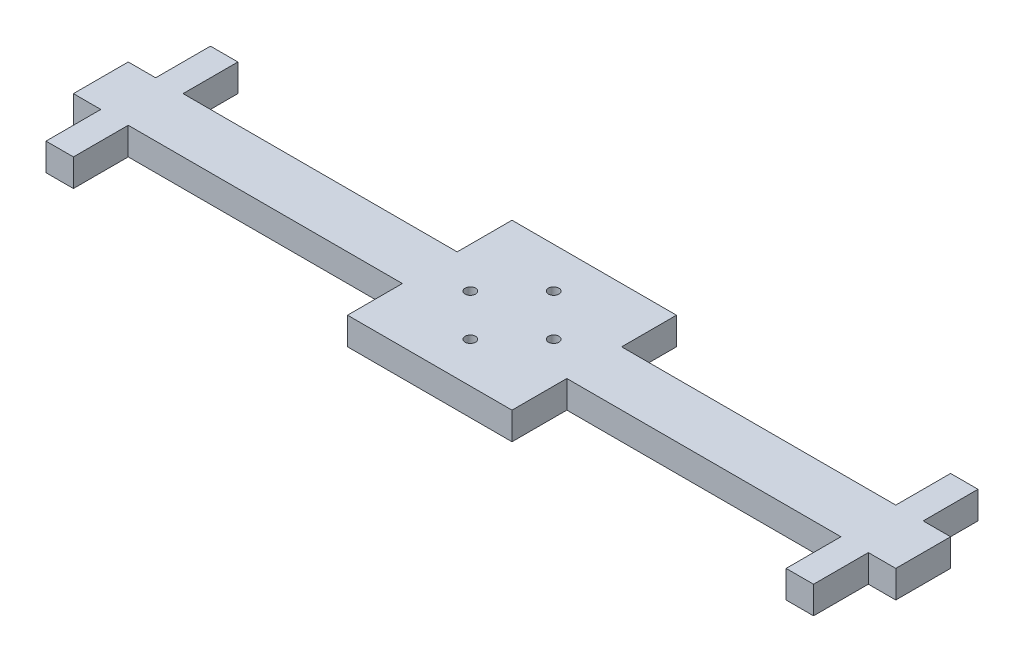
ISO-10303-21;
HEADER;
FILE_DESCRIPTION(('STEP AP214'),'2;1');
FILE_NAME('part.step','',(''),(''),'','','');
FILE_SCHEMA(('AUTOMOTIVE_DESIGN { 1 0 10303 214 1 1 1 1 }'));
ENDSEC;
DATA;
#1=APPLICATION_CONTEXT('core data for automotive mechanical design processes');
#2=APPLICATION_PROTOCOL_DEFINITION('international standard','automotive_design',2000,#1);
#3=PRODUCT_CONTEXT('',#1,'mechanical');
#4=PRODUCT('Part','Part','',(#3));
#5=PRODUCT_RELATED_PRODUCT_CATEGORY('part','',(#4));
#6=PRODUCT_DEFINITION_FORMATION('','',#4);
#7=PRODUCT_DEFINITION_CONTEXT('part definition',#1,'design');
#8=PRODUCT_DEFINITION('design','',#6,#7);
#9=PRODUCT_DEFINITION_SHAPE('','',#8);
#10=(LENGTH_UNIT() NAMED_UNIT(*) SI_UNIT(.MILLI.,.METRE.));
#11=(NAMED_UNIT(*) PLANE_ANGLE_UNIT() SI_UNIT($,.RADIAN.));
#12=(NAMED_UNIT(*) SI_UNIT($,.STERADIAN.) SOLID_ANGLE_UNIT());
#13=UNCERTAINTY_MEASURE_WITH_UNIT(LENGTH_MEASURE(1.E-05),#10,'distance_accuracy_value','');
#14=(GEOMETRIC_REPRESENTATION_CONTEXT(3) GLOBAL_UNCERTAINTY_ASSIGNED_CONTEXT((#13)) GLOBAL_UNIT_ASSIGNED_CONTEXT((#10,
#11,#12)) REPRESENTATION_CONTEXT('',''));
#15=CARTESIAN_POINT('',(0.,0.,0.));
#16=DIRECTION('',(0.,0.,1.));
#17=DIRECTION('',(1.,0.,0.));
#18=AXIS2_PLACEMENT_3D('',#15,#16,#17);
#19=CARTESIAN_POINT('',(0.,6.35,0.));
#20=DIRECTION('',(0.,-1.,0.));
#21=DIRECTION('',(0.,0.,-1.));
#22=AXIS2_PLACEMENT_3D('',#19,#20,#21);
#23=PLANE('',#22);
#24=DIRECTION('',(1.,0.,0.));
#25=VECTOR('',#24,1.);
#26=CARTESIAN_POINT('',(6.35,6.35,0.));
#27=LINE('',#26,#25);
#28=CARTESIAN_POINT('',(0.,6.35,0.));
#29=VERTEX_POINT('',#28);
#30=CARTESIAN_POINT('',(6.35,6.35,0.));
#31=VERTEX_POINT('',#30);
#32=EDGE_CURVE('E305',#29,#31,#27,.T.);
#33=ORIENTED_EDGE('',*,*,#32,.T.);
#34=DIRECTION('',(0.,0.,1.));
#35=VECTOR('',#34,1.);
#36=CARTESIAN_POINT('',(6.35,6.35,12.7));
#37=LINE('',#36,#35);
#38=CARTESIAN_POINT('',(6.35,6.35,12.7));
#39=VERTEX_POINT('',#38);
#40=EDGE_CURVE('E153',#31,#39,#37,.T.);
#41=ORIENTED_EDGE('',*,*,#40,.T.);
#42=DIRECTION('',(1.,0.,0.));
#43=VECTOR('',#42,1.);
#44=CARTESIAN_POINT('',(12.7,6.35,12.7));
#45=LINE('',#44,#43);
#46=CARTESIAN_POINT('',(12.7,6.35,12.7));
#47=VERTEX_POINT('',#46);
#48=EDGE_CURVE('E380',#39,#47,#45,.T.);
#49=ORIENTED_EDGE('',*,*,#48,.T.);
#50=DIRECTION('',(0.,0.,-1.));
#51=VECTOR('',#50,1.);
#52=CARTESIAN_POINT('',(12.7,6.35,0.));
#53=LINE('',#52,#51);
#54=CARTESIAN_POINT('',(12.7,6.35,0.));
#55=VERTEX_POINT('',#54);
#56=EDGE_CURVE('E399',#47,#55,#53,.T.);
#57=ORIENTED_EDGE('',*,*,#56,.T.);
#58=DIRECTION('',(1.,0.,0.));
#59=VECTOR('',#58,1.);
#60=CARTESIAN_POINT('',(76.2,6.35,0.));
#61=LINE('',#60,#59);
#62=CARTESIAN_POINT('',(76.2,6.35,0.));
#63=VERTEX_POINT('',#62);
#64=EDGE_CURVE('E396',#55,#63,#61,.T.);
#65=ORIENTED_EDGE('',*,*,#64,.T.);
#66=DIRECTION('',(0.,0.,1.));
#67=VECTOR('',#66,1.);
#68=CARTESIAN_POINT('',(76.2,6.35,12.7));
#69=LINE('',#68,#67);
#70=CARTESIAN_POINT('',(76.2,6.35,12.7));
#71=VERTEX_POINT('',#70);
#72=EDGE_CURVE('E398',#63,#71,#69,.T.);
#73=ORIENTED_EDGE('',*,*,#72,.T.);
#74=DIRECTION('',(1.,0.,0.));
#75=VECTOR('',#74,1.);
#76=CARTESIAN_POINT('',(114.3,6.35,12.7));
#77=LINE('',#76,#75);
#78=CARTESIAN_POINT('',(114.3,6.35,12.7));
#79=VERTEX_POINT('',#78);
#80=EDGE_CURVE('E401',#71,#79,#77,.T.);
#81=ORIENTED_EDGE('',*,*,#80,.T.);
#82=DIRECTION('',(0.,0.,-1.));
#83=VECTOR('',#82,1.);
#84=CARTESIAN_POINT('',(114.3,6.35,0.));
#85=LINE('',#84,#83);
#86=CARTESIAN_POINT('',(114.3,6.35,0.));
#87=VERTEX_POINT('',#86);
#88=EDGE_CURVE('E407',#79,#87,#85,.T.);
#89=ORIENTED_EDGE('',*,*,#88,.T.);
#90=DIRECTION('',(1.,0.,0.));
#91=VECTOR('',#90,1.);
#92=CARTESIAN_POINT('',(177.8,6.35,0.));
#93=LINE('',#92,#91);
#94=CARTESIAN_POINT('',(177.8,6.35,0.));
#95=VERTEX_POINT('',#94);
#96=EDGE_CURVE('E409',#87,#95,#93,.T.);
#97=ORIENTED_EDGE('',*,*,#96,.T.);
#98=DIRECTION('',(0.,0.,1.));
#99=VECTOR('',#98,1.);
#100=CARTESIAN_POINT('',(177.8,6.35,12.7));
#101=LINE('',#100,#99);
#102=CARTESIAN_POINT('',(177.8,6.35,12.7));
#103=VERTEX_POINT('',#102);
#104=EDGE_CURVE('E411',#95,#103,#101,.T.);
#105=ORIENTED_EDGE('',*,*,#104,.T.);
#106=DIRECTION('',(1.,0.,0.));
#107=VECTOR('',#106,1.);
#108=CARTESIAN_POINT('',(184.15,6.35,12.7));
#109=LINE('',#108,#107);
#110=CARTESIAN_POINT('',(184.15,6.35,12.7));
#111=VERTEX_POINT('',#110);
#112=EDGE_CURVE('E413',#103,#111,#109,.T.);
#113=ORIENTED_EDGE('',*,*,#112,.T.);
#114=DIRECTION('',(0.,0.,-1.));
#115=VECTOR('',#114,1.);
#116=CARTESIAN_POINT('',(184.15,6.35,0.));
#117=LINE('',#116,#115);
#118=CARTESIAN_POINT('',(184.15,6.35,0.));
#119=VERTEX_POINT('',#118);
#120=EDGE_CURVE('E415',#111,#119,#117,.T.);
#121=ORIENTED_EDGE('',*,*,#120,.T.);
#122=DIRECTION('',(1.,0.,0.));
#123=VECTOR('',#122,1.);
#124=CARTESIAN_POINT('',(190.5,6.35,0.));
#125=LINE('',#124,#123);
#126=CARTESIAN_POINT('',(190.5,6.35,0.));
#127=VERTEX_POINT('',#126);
#128=EDGE_CURVE('E417',#119,#127,#125,.T.);
#129=ORIENTED_EDGE('',*,*,#128,.T.);
#130=DIRECTION('',(0.,0.,-1.));
#131=VECTOR('',#130,1.);
#132=CARTESIAN_POINT('',(190.5,6.35,-12.7));
#133=LINE('',#132,#131);
#134=CARTESIAN_POINT('',(190.5,6.35,-12.7));
#135=VERTEX_POINT('',#134);
#136=EDGE_CURVE('E419',#127,#135,#133,.T.);
#137=ORIENTED_EDGE('',*,*,#136,.T.);
#138=DIRECTION('',(-1.,0.,0.));
#139=VECTOR('',#138,1.);
#140=CARTESIAN_POINT('',(184.15,6.35,-12.7));
#141=LINE('',#140,#139);
#142=CARTESIAN_POINT('',(184.15,6.35,-12.7));
#143=VERTEX_POINT('',#142);
#144=EDGE_CURVE('E421',#135,#143,#141,.T.);
#145=ORIENTED_EDGE('',*,*,#144,.T.);
#146=DIRECTION('',(0.,0.,-1.));
#147=VECTOR('',#146,1.);
#148=CARTESIAN_POINT('',(184.15,6.35,-25.4));
#149=LINE('',#148,#147);
#150=CARTESIAN_POINT('',(184.15,6.35,-25.4));
#151=VERTEX_POINT('',#150);
#152=EDGE_CURVE('E423',#143,#151,#149,.T.);
#153=ORIENTED_EDGE('',*,*,#152,.T.);
#154=DIRECTION('',(-1.,0.,0.));
#155=VECTOR('',#154,1.);
#156=CARTESIAN_POINT('',(177.8,6.35,-25.4));
#157=LINE('',#156,#155);
#158=CARTESIAN_POINT('',(177.8,6.35,-25.4));
#159=VERTEX_POINT('',#158);
#160=EDGE_CURVE('E425',#151,#159,#157,.T.);
#161=ORIENTED_EDGE('',*,*,#160,.T.);
#162=DIRECTION('',(0.,0.,1.));
#163=VECTOR('',#162,1.);
#164=CARTESIAN_POINT('',(177.8,6.35,-12.7));
#165=LINE('',#164,#163);
#166=CARTESIAN_POINT('',(177.8,6.35,-12.7));
#167=VERTEX_POINT('',#166);
#168=EDGE_CURVE('E427',#159,#167,#165,.T.);
#169=ORIENTED_EDGE('',*,*,#168,.T.);
#170=DIRECTION('',(-1.,0.,0.));
#171=VECTOR('',#170,1.);
#172=CARTESIAN_POINT('',(114.3,6.35,-12.7));
#173=LINE('',#172,#171);
#174=CARTESIAN_POINT('',(114.3,6.35,-12.7));
#175=VERTEX_POINT('',#174);
#176=EDGE_CURVE('E429',#167,#175,#173,.T.);
#177=ORIENTED_EDGE('',*,*,#176,.T.);
#178=DIRECTION('',(0.,0.,-1.));
#179=VECTOR('',#178,1.);
#180=CARTESIAN_POINT('',(114.3,6.35,-25.4));
#181=LINE('',#180,#179);
#182=CARTESIAN_POINT('',(114.3,6.35,-25.4));
#183=VERTEX_POINT('',#182);
#184=EDGE_CURVE('E431',#175,#183,#181,.T.);
#185=ORIENTED_EDGE('',*,*,#184,.T.);
#186=DIRECTION('',(-1.,0.,0.));
#187=VECTOR('',#186,1.);
#188=CARTESIAN_POINT('',(76.2,6.35,-25.4));
#189=LINE('',#188,#187);
#190=CARTESIAN_POINT('',(76.2,6.35,-25.4));
#191=VERTEX_POINT('',#190);
#192=EDGE_CURVE('E433',#183,#191,#189,.T.);
#193=ORIENTED_EDGE('',*,*,#192,.T.);
#194=DIRECTION('',(0.,0.,1.));
#195=VECTOR('',#194,1.);
#196=CARTESIAN_POINT('',(76.2,6.35,-12.7));
#197=LINE('',#196,#195);
#198=CARTESIAN_POINT('',(76.2,6.35,-12.7));
#199=VERTEX_POINT('',#198);
#200=EDGE_CURVE('E435',#191,#199,#197,.T.);
#201=ORIENTED_EDGE('',*,*,#200,.T.);
#202=DIRECTION('',(-1.,0.,0.));
#203=VECTOR('',#202,1.);
#204=CARTESIAN_POINT('',(12.7,6.35,-12.7));
#205=LINE('',#204,#203);
#206=CARTESIAN_POINT('',(12.7,6.35,-12.7));
#207=VERTEX_POINT('',#206);
#208=EDGE_CURVE('E437',#199,#207,#205,.T.);
#209=ORIENTED_EDGE('',*,*,#208,.T.);
#210=DIRECTION('',(0.,0.,-1.));
#211=VECTOR('',#210,1.);
#212=CARTESIAN_POINT('',(12.7,6.35,-25.4));
#213=LINE('',#212,#211);
#214=CARTESIAN_POINT('',(12.7,6.35,-25.4));
#215=VERTEX_POINT('',#214);
#216=EDGE_CURVE('E439',#207,#215,#213,.T.);
#217=ORIENTED_EDGE('',*,*,#216,.T.);
#218=DIRECTION('',(-1.,0.,0.));
#219=VECTOR('',#218,1.);
#220=CARTESIAN_POINT('',(6.34999999999999,6.35,-25.4));
#221=LINE('',#220,#219);
#222=CARTESIAN_POINT('',(6.34999999999999,6.35,-25.4));
#223=VERTEX_POINT('',#222);
#224=EDGE_CURVE('E232',#215,#223,#221,.T.);
#225=ORIENTED_EDGE('',*,*,#224,.T.);
#226=DIRECTION('',(0.,0.,1.));
#227=VECTOR('',#226,1.);
#228=CARTESIAN_POINT('',(6.35,6.35,-12.7));
#229=LINE('',#228,#227);
#230=CARTESIAN_POINT('',(6.35,6.35,-12.7));
#231=VERTEX_POINT('',#230);
#232=EDGE_CURVE('E226',#223,#231,#229,.T.);
#233=ORIENTED_EDGE('',*,*,#232,.T.);
#234=DIRECTION('',(-1.,0.,0.));
#235=VECTOR('',#234,1.);
#236=CARTESIAN_POINT('',(0.,6.35,-12.7));
#237=LINE('',#236,#235);
#238=CARTESIAN_POINT('',(0.,6.35,-12.7));
#239=VERTEX_POINT('',#238);
#240=EDGE_CURVE('E230',#231,#239,#237,.T.);
#241=ORIENTED_EDGE('',*,*,#240,.T.);
#242=DIRECTION('',(0.,0.,1.));
#243=VECTOR('',#242,1.);
#244=CARTESIAN_POINT('',(0.,6.35,0.));
#245=LINE('',#244,#243);
#246=EDGE_CURVE('E50',#239,#29,#245,.T.);
#247=ORIENTED_EDGE('',*,*,#246,.T.);
#248=EDGE_LOOP('',(#33,#41,#49,#57,#65,#73,#81,#89,#97,#105,#113,#121,#129,#137,#145,#153,#161,
#169,#177,#185,#193,#201,#209,#217,#225,#233,#241,#247));
#249=FACE_BOUND('',#248,.T.);
#250=CARTESIAN_POINT('',(85.598,6.35,-6.35000000000001));
#251=DIRECTION('',(0.,1.,0.));
#252=DIRECTION('',(0.,0.,1.));
#253=AXIS2_PLACEMENT_3D('',#250,#251,#252);
#254=CIRCLE('',#253,1.2065);
#255=CARTESIAN_POINT('',(85.598,6.35,-5.14350000000001));
#256=VERTEX_POINT('',#255);
#257=EDGE_CURVE('E254',#256,#256,#254,.T.);
#258=ORIENTED_EDGE('',*,*,#257,.F.);
#259=EDGE_LOOP('',(#258));
#260=FACE_BOUND('',#259,.T.);
#261=CARTESIAN_POINT('',(104.902,6.35,-6.35000000000001));
#262=DIRECTION('',(0.,1.,0.));
#263=DIRECTION('',(0.,0.,1.));
#264=AXIS2_PLACEMENT_3D('',#261,#262,#263);
#265=CIRCLE('',#264,1.2065);
#266=CARTESIAN_POINT('',(104.902,6.35,-5.14350000000001));
#267=VERTEX_POINT('',#266);
#268=EDGE_CURVE('E503',#267,#267,#265,.T.);
#269=ORIENTED_EDGE('',*,*,#268,.F.);
#270=EDGE_LOOP('',(#269));
#271=FACE_BOUND('',#270,.T.);
#272=CARTESIAN_POINT('',(95.25,6.35,-16.002));
#273=DIRECTION('',(0.,1.,0.));
#274=DIRECTION('',(0.,0.,1.));
#275=AXIS2_PLACEMENT_3D('',#272,#273,#274);
#276=CIRCLE('',#275,1.2065);
#277=CARTESIAN_POINT('',(95.25,6.35,-14.7955));
#278=VERTEX_POINT('',#277);
#279=EDGE_CURVE('E497',#278,#278,#276,.T.);
#280=ORIENTED_EDGE('',*,*,#279,.F.);
#281=EDGE_LOOP('',(#280));
#282=FACE_BOUND('',#281,.T.);
#283=CARTESIAN_POINT('',(95.25,6.35,3.30199999999999));
#284=DIRECTION('',(0.,1.,0.));
#285=DIRECTION('',(0.,0.,1.));
#286=AXIS2_PLACEMENT_3D('',#283,#284,#285);
#287=CIRCLE('',#286,1.2065);
#288=CARTESIAN_POINT('',(95.25,6.35,4.50849999999999));
#289=VERTEX_POINT('',#288);
#290=EDGE_CURVE('E488',#289,#289,#287,.T.);
#291=ORIENTED_EDGE('',*,*,#290,.F.);
#292=EDGE_LOOP('',(#291));
#293=FACE_BOUND('',#292,.T.);
#294=ADVANCED_FACE('F33',(#249,#260,#271,#282,#293),#23,.F.);
#295=CARTESIAN_POINT('',(0.,0.,0.));
#296=DIRECTION('',(0.,-1.,0.));
#297=DIRECTION('',(0.,0.,-1.));
#298=AXIS2_PLACEMENT_3D('',#295,#296,#297);
#299=PLANE('',#298);
#300=CARTESIAN_POINT('',(95.25,0.,-16.002));
#301=DIRECTION('',(0.,1.,0.));
#302=DIRECTION('',(0.,0.,1.));
#303=AXIS2_PLACEMENT_3D('',#300,#301,#302);
#304=CIRCLE('',#303,1.2065);
#305=CARTESIAN_POINT('',(95.25,0.,-14.7955));
#306=VERTEX_POINT('',#305);
#307=EDGE_CURVE('E494',#306,#306,#304,.T.);
#308=ORIENTED_EDGE('',*,*,#307,.T.);
#309=EDGE_LOOP('',(#308));
#310=FACE_BOUND('',#309,.T.);
#311=CARTESIAN_POINT('',(85.598,0.,-6.35000000000001));
#312=DIRECTION('',(0.,1.,0.));
#313=DIRECTION('',(0.,0.,1.));
#314=AXIS2_PLACEMENT_3D('',#311,#312,#313);
#315=CIRCLE('',#314,1.2065);
#316=CARTESIAN_POINT('',(85.598,0.,-5.14350000000001));
#317=VERTEX_POINT('',#316);
#318=EDGE_CURVE('E506',#317,#317,#315,.T.);
#319=ORIENTED_EDGE('',*,*,#318,.T.);
#320=EDGE_LOOP('',(#319));
#321=FACE_BOUND('',#320,.T.);
#322=DIRECTION('',(1.,0.,0.));
#323=VECTOR('',#322,1.);
#324=CARTESIAN_POINT('',(6.35,0.,0.));
#325=LINE('',#324,#323);
#326=CARTESIAN_POINT('',(0.,0.,0.));
#327=VERTEX_POINT('',#326);
#328=CARTESIAN_POINT('',(6.35,0.,0.));
#329=VERTEX_POINT('',#328);
#330=EDGE_CURVE('E250',#327,#329,#325,.T.);
#331=ORIENTED_EDGE('',*,*,#330,.F.);
#332=DIRECTION('',(0.,0.,1.));
#333=VECTOR('',#332,1.);
#334=CARTESIAN_POINT('',(0.,0.,0.));
#335=LINE('',#334,#333);
#336=CARTESIAN_POINT('',(0.,0.,-12.7));
#337=VERTEX_POINT('',#336);
#338=EDGE_CURVE('E145',#337,#327,#335,.T.);
#339=ORIENTED_EDGE('',*,*,#338,.F.);
#340=DIRECTION('',(-1.,0.,0.));
#341=VECTOR('',#340,1.);
#342=CARTESIAN_POINT('',(0.,0.,-12.7));
#343=LINE('',#342,#341);
#344=CARTESIAN_POINT('',(6.35,0.,-12.7));
#345=VERTEX_POINT('',#344);
#346=EDGE_CURVE('E139',#345,#337,#343,.T.);
#347=ORIENTED_EDGE('',*,*,#346,.F.);
#348=DIRECTION('',(0.,0.,1.));
#349=VECTOR('',#348,1.);
#350=CARTESIAN_POINT('',(6.35,0.,-12.7));
#351=LINE('',#350,#349);
#352=CARTESIAN_POINT('',(6.34999999999999,0.,-25.4));
#353=VERTEX_POINT('',#352);
#354=EDGE_CURVE('E240',#353,#345,#351,.T.);
#355=ORIENTED_EDGE('',*,*,#354,.F.);
#356=DIRECTION('',(-1.,0.,0.));
#357=VECTOR('',#356,1.);
#358=CARTESIAN_POINT('',(6.34999999999999,0.,-25.4));
#359=LINE('',#358,#357);
#360=CARTESIAN_POINT('',(12.7,0.,-25.4));
#361=VERTEX_POINT('',#360);
#362=EDGE_CURVE('E300',#361,#353,#359,.T.);
#363=ORIENTED_EDGE('',*,*,#362,.F.);
#364=DIRECTION('',(0.,0.,-1.));
#365=VECTOR('',#364,1.);
#366=CARTESIAN_POINT('',(12.7,0.,-25.4));
#367=LINE('',#366,#365);
#368=CARTESIAN_POINT('',(12.7,0.,-12.7));
#369=VERTEX_POINT('',#368);
#370=EDGE_CURVE('E298',#369,#361,#367,.T.);
#371=ORIENTED_EDGE('',*,*,#370,.F.);
#372=DIRECTION('',(-1.,0.,0.));
#373=VECTOR('',#372,1.);
#374=CARTESIAN_POINT('',(12.7,0.,-12.7));
#375=LINE('',#374,#373);
#376=CARTESIAN_POINT('',(76.2,0.,-12.7));
#377=VERTEX_POINT('',#376);
#378=EDGE_CURVE('E296',#377,#369,#375,.T.);
#379=ORIENTED_EDGE('',*,*,#378,.F.);
#380=DIRECTION('',(0.,0.,1.));
#381=VECTOR('',#380,1.);
#382=CARTESIAN_POINT('',(76.2,0.,-12.7));
#383=LINE('',#382,#381);
#384=CARTESIAN_POINT('',(76.2,0.,-25.4));
#385=VERTEX_POINT('',#384);
#386=EDGE_CURVE('E294',#385,#377,#383,.T.);
#387=ORIENTED_EDGE('',*,*,#386,.F.);
#388=DIRECTION('',(-1.,0.,0.));
#389=VECTOR('',#388,1.);
#390=CARTESIAN_POINT('',(76.2,0.,-25.4));
#391=LINE('',#390,#389);
#392=CARTESIAN_POINT('',(114.3,0.,-25.4));
#393=VERTEX_POINT('',#392);
#394=EDGE_CURVE('E292',#393,#385,#391,.T.);
#395=ORIENTED_EDGE('',*,*,#394,.F.);
#396=DIRECTION('',(0.,0.,-1.));
#397=VECTOR('',#396,1.);
#398=CARTESIAN_POINT('',(114.3,0.,-25.4));
#399=LINE('',#398,#397);
#400=CARTESIAN_POINT('',(114.3,0.,-12.7));
#401=VERTEX_POINT('',#400);
#402=EDGE_CURVE('E290',#401,#393,#399,.T.);
#403=ORIENTED_EDGE('',*,*,#402,.F.);
#404=DIRECTION('',(-1.,0.,0.));
#405=VECTOR('',#404,1.);
#406=CARTESIAN_POINT('',(114.3,0.,-12.7));
#407=LINE('',#406,#405);
#408=CARTESIAN_POINT('',(177.8,0.,-12.7));
#409=VERTEX_POINT('',#408);
#410=EDGE_CURVE('E288',#409,#401,#407,.T.);
#411=ORIENTED_EDGE('',*,*,#410,.F.);
#412=DIRECTION('',(0.,0.,1.));
#413=VECTOR('',#412,1.);
#414=CARTESIAN_POINT('',(177.8,0.,-12.7));
#415=LINE('',#414,#413);
#416=CARTESIAN_POINT('',(177.8,0.,-25.4));
#417=VERTEX_POINT('',#416);
#418=EDGE_CURVE('E286',#417,#409,#415,.T.);
#419=ORIENTED_EDGE('',*,*,#418,.F.);
#420=DIRECTION('',(-1.,0.,0.));
#421=VECTOR('',#420,1.);
#422=CARTESIAN_POINT('',(177.8,0.,-25.4));
#423=LINE('',#422,#421);
#424=CARTESIAN_POINT('',(184.15,0.,-25.4));
#425=VERTEX_POINT('',#424);
#426=EDGE_CURVE('E284',#425,#417,#423,.T.);
#427=ORIENTED_EDGE('',*,*,#426,.F.);
#428=DIRECTION('',(0.,0.,-1.));
#429=VECTOR('',#428,1.);
#430=CARTESIAN_POINT('',(184.15,0.,-25.4));
#431=LINE('',#430,#429);
#432=CARTESIAN_POINT('',(184.15,0.,-12.7));
#433=VERTEX_POINT('',#432);
#434=EDGE_CURVE('E282',#433,#425,#431,.T.);
#435=ORIENTED_EDGE('',*,*,#434,.F.);
#436=DIRECTION('',(-1.,0.,0.));
#437=VECTOR('',#436,1.);
#438=CARTESIAN_POINT('',(184.15,0.,-12.7));
#439=LINE('',#438,#437);
#440=CARTESIAN_POINT('',(190.5,0.,-12.7));
#441=VERTEX_POINT('',#440);
#442=EDGE_CURVE('E280',#441,#433,#439,.T.);
#443=ORIENTED_EDGE('',*,*,#442,.F.);
#444=DIRECTION('',(0.,0.,-1.));
#445=VECTOR('',#444,1.);
#446=CARTESIAN_POINT('',(190.5,0.,-12.7));
#447=LINE('',#446,#445);
#448=CARTESIAN_POINT('',(190.5,0.,0.));
#449=VERTEX_POINT('',#448);
#450=EDGE_CURVE('E278',#449,#441,#447,.T.);
#451=ORIENTED_EDGE('',*,*,#450,.F.);
#452=DIRECTION('',(1.,0.,0.));
#453=VECTOR('',#452,1.);
#454=CARTESIAN_POINT('',(190.5,0.,0.));
#455=LINE('',#454,#453);
#456=CARTESIAN_POINT('',(184.15,0.,0.));
#457=VERTEX_POINT('',#456);
#458=EDGE_CURVE('E276',#457,#449,#455,.T.);
#459=ORIENTED_EDGE('',*,*,#458,.F.);
#460=DIRECTION('',(0.,0.,-1.));
#461=VECTOR('',#460,1.);
#462=CARTESIAN_POINT('',(184.15,0.,0.));
#463=LINE('',#462,#461);
#464=CARTESIAN_POINT('',(184.15,0.,12.7));
#465=VERTEX_POINT('',#464);
#466=EDGE_CURVE('E274',#465,#457,#463,.T.);
#467=ORIENTED_EDGE('',*,*,#466,.F.);
#468=DIRECTION('',(1.,0.,0.));
#469=VECTOR('',#468,1.);
#470=CARTESIAN_POINT('',(184.15,0.,12.7));
#471=LINE('',#470,#469);
#472=CARTESIAN_POINT('',(177.8,0.,12.7));
#473=VERTEX_POINT('',#472);
#474=EDGE_CURVE('E272',#473,#465,#471,.T.);
#475=ORIENTED_EDGE('',*,*,#474,.F.);
#476=DIRECTION('',(0.,0.,1.));
#477=VECTOR('',#476,1.);
#478=CARTESIAN_POINT('',(177.8,0.,12.7));
#479=LINE('',#478,#477);
#480=CARTESIAN_POINT('',(177.8,0.,0.));
#481=VERTEX_POINT('',#480);
#482=EDGE_CURVE('E270',#481,#473,#479,.T.);
#483=ORIENTED_EDGE('',*,*,#482,.F.);
#484=DIRECTION('',(1.,0.,0.));
#485=VECTOR('',#484,1.);
#486=CARTESIAN_POINT('',(177.8,0.,0.));
#487=LINE('',#486,#485);
#488=CARTESIAN_POINT('',(114.3,0.,0.));
#489=VERTEX_POINT('',#488);
#490=EDGE_CURVE('E268',#489,#481,#487,.T.);
#491=ORIENTED_EDGE('',*,*,#490,.F.);
#492=DIRECTION('',(0.,0.,-1.));
#493=VECTOR('',#492,1.);
#494=CARTESIAN_POINT('',(114.3,0.,0.));
#495=LINE('',#494,#493);
#496=CARTESIAN_POINT('',(114.3,0.,12.7));
#497=VERTEX_POINT('',#496);
#498=EDGE_CURVE('E266',#497,#489,#495,.T.);
#499=ORIENTED_EDGE('',*,*,#498,.F.);
#500=DIRECTION('',(1.,0.,0.));
#501=VECTOR('',#500,1.);
#502=CARTESIAN_POINT('',(114.3,0.,12.7));
#503=LINE('',#502,#501);
#504=CARTESIAN_POINT('',(76.2,0.,12.7));
#505=VERTEX_POINT('',#504);
#506=EDGE_CURVE('E264',#505,#497,#503,.T.);
#507=ORIENTED_EDGE('',*,*,#506,.F.);
#508=DIRECTION('',(0.,0.,1.));
#509=VECTOR('',#508,1.);
#510=CARTESIAN_POINT('',(76.2,0.,12.7));
#511=LINE('',#510,#509);
#512=CARTESIAN_POINT('',(76.2,0.,0.));
#513=VERTEX_POINT('',#512);
#514=EDGE_CURVE('E262',#513,#505,#511,.T.);
#515=ORIENTED_EDGE('',*,*,#514,.F.);
#516=DIRECTION('',(1.,0.,0.));
#517=VECTOR('',#516,1.);
#518=CARTESIAN_POINT('',(76.2,0.,0.));
#519=LINE('',#518,#517);
#520=CARTESIAN_POINT('',(12.7,0.,0.));
#521=VERTEX_POINT('',#520);
#522=EDGE_CURVE('E260',#521,#513,#519,.T.);
#523=ORIENTED_EDGE('',*,*,#522,.F.);
#524=DIRECTION('',(0.,0.,-1.));
#525=VECTOR('',#524,1.);
#526=CARTESIAN_POINT('',(12.7,0.,0.));
#527=LINE('',#526,#525);
#528=CARTESIAN_POINT('',(12.7,0.,12.7));
#529=VERTEX_POINT('',#528);
#530=EDGE_CURVE('E258',#529,#521,#527,.T.);
#531=ORIENTED_EDGE('',*,*,#530,.F.);
#532=DIRECTION('',(1.,0.,0.));
#533=VECTOR('',#532,1.);
#534=CARTESIAN_POINT('',(12.7,0.,12.7));
#535=LINE('',#534,#533);
#536=CARTESIAN_POINT('',(6.35,0.,12.7));
#537=VERTEX_POINT('',#536);
#538=EDGE_CURVE('E256',#537,#529,#535,.T.);
#539=ORIENTED_EDGE('',*,*,#538,.F.);
#540=DIRECTION('',(0.,0.,1.));
#541=VECTOR('',#540,1.);
#542=CARTESIAN_POINT('',(6.35,0.,12.7));
#543=LINE('',#542,#541);
#544=EDGE_CURVE('E253',#329,#537,#543,.T.);
#545=ORIENTED_EDGE('',*,*,#544,.F.);
#546=EDGE_LOOP('',(#331,#339,#347,#355,#363,#371,#379,#387,#395,#403,#411,#419,#427,#435,#443,
#451,#459,#467,#475,#483,#491,#499,#507,#515,#523,#531,#539,#545));
#547=FACE_BOUND('',#546,.T.);
#548=CARTESIAN_POINT('',(104.902,0.,-6.35000000000001));
#549=DIRECTION('',(0.,1.,0.));
#550=DIRECTION('',(0.,0.,1.));
#551=AXIS2_PLACEMENT_3D('',#548,#549,#550);
#552=CIRCLE('',#551,1.2065);
#553=CARTESIAN_POINT('',(104.902,0.,-5.14350000000001));
#554=VERTEX_POINT('',#553);
#555=EDGE_CURVE('E500',#554,#554,#552,.T.);
#556=ORIENTED_EDGE('',*,*,#555,.T.);
#557=EDGE_LOOP('',(#556));
#558=FACE_BOUND('',#557,.T.);
#559=CARTESIAN_POINT('',(95.25,0.,3.30199999999999));
#560=DIRECTION('',(0.,1.,0.));
#561=DIRECTION('',(0.,0.,1.));
#562=AXIS2_PLACEMENT_3D('',#559,#560,#561);
#563=CIRCLE('',#562,1.2065);
#564=CARTESIAN_POINT('',(95.25,0.,4.50849999999999));
#565=VERTEX_POINT('',#564);
#566=EDGE_CURVE('E491',#565,#565,#563,.T.);
#567=ORIENTED_EDGE('',*,*,#566,.T.);
#568=EDGE_LOOP('',(#567));
#569=FACE_BOUND('',#568,.T.);
#570=ADVANCED_FACE('F384',(#310,#321,#547,#558,#569),#299,.T.);
#571=CARTESIAN_POINT('',(6.35,6.35,0.));
#572=DIRECTION('',(0.,0.,-1.));
#573=DIRECTION('',(-1.,0.,0.));
#574=AXIS2_PLACEMENT_3D('',#571,#572,#573);
#575=PLANE('',#574);
#576=ORIENTED_EDGE('',*,*,#330,.T.);
#577=DIRECTION('',(0.,-1.,0.));
#578=VECTOR('',#577,1.);
#579=CARTESIAN_POINT('',(6.35,6.35,0.));
#580=LINE('',#579,#578);
#581=EDGE_CURVE('E11',#31,#329,#580,.T.);
#582=ORIENTED_EDGE('',*,*,#581,.F.);
#583=ORIENTED_EDGE('',*,*,#32,.F.);
#584=DIRECTION('',(0.,-1.,0.));
#585=VECTOR('',#584,1.);
#586=CARTESIAN_POINT('',(0.,6.35,0.));
#587=LINE('',#586,#585);
#588=EDGE_CURVE('E246',#29,#327,#587,.T.);
#589=ORIENTED_EDGE('',*,*,#588,.T.);
#590=EDGE_LOOP('',(#576,#582,#583,#589));
#591=FACE_BOUND('',#590,.T.);
#592=ADVANCED_FACE('F35',(#591),#575,.F.);
#593=CARTESIAN_POINT('',(6.35,6.35,12.7));
#594=DIRECTION('',(1.,0.,0.));
#595=DIRECTION('',(0.,0.,-1.));
#596=AXIS2_PLACEMENT_3D('',#593,#594,#595);
#597=PLANE('',#596);
#598=ORIENTED_EDGE('',*,*,#544,.T.);
#599=DIRECTION('',(0.,-1.,0.));
#600=VECTOR('',#599,1.);
#601=CARTESIAN_POINT('',(6.35,6.35,12.7));
#602=LINE('',#601,#600);
#603=EDGE_CURVE('E42',#39,#537,#602,.T.);
#604=ORIENTED_EDGE('',*,*,#603,.F.);
#605=ORIENTED_EDGE('',*,*,#40,.F.);
#606=ORIENTED_EDGE('',*,*,#581,.T.);
#607=EDGE_LOOP('',(#598,#604,#605,#606));
#608=FACE_BOUND('',#607,.T.);
#609=ADVANCED_FACE('F778',(#608),#597,.F.);
#610=CARTESIAN_POINT('',(12.7,6.35,12.7));
#611=DIRECTION('',(0.,0.,-1.));
#612=DIRECTION('',(-1.,0.,0.));
#613=AXIS2_PLACEMENT_3D('',#610,#611,#612);
#614=PLANE('',#613);
#615=ORIENTED_EDGE('',*,*,#538,.T.);
#616=DIRECTION('',(0.,-1.,0.));
#617=VECTOR('',#616,1.);
#618=CARTESIAN_POINT('',(12.7,6.35,12.7));
#619=LINE('',#618,#617);
#620=EDGE_CURVE('E372',#47,#529,#619,.T.);
#621=ORIENTED_EDGE('',*,*,#620,.F.);
#622=ORIENTED_EDGE('',*,*,#48,.F.);
#623=ORIENTED_EDGE('',*,*,#603,.T.);
#624=EDGE_LOOP('',(#615,#621,#622,#623));
#625=FACE_BOUND('',#624,.T.);
#626=ADVANCED_FACE('F378',(#625),#614,.F.);
#627=CARTESIAN_POINT('',(12.7,6.35,0.));
#628=DIRECTION('',(-1.,0.,0.));
#629=DIRECTION('',(0.,0.,1.));
#630=AXIS2_PLACEMENT_3D('',#627,#628,#629);
#631=PLANE('',#630);
#632=ORIENTED_EDGE('',*,*,#530,.T.);
#633=DIRECTION('',(0.,-1.,0.));
#634=VECTOR('',#633,1.);
#635=CARTESIAN_POINT('',(12.7,6.35,0.));
#636=LINE('',#635,#634);
#637=EDGE_CURVE('E369',#55,#521,#636,.T.);
#638=ORIENTED_EDGE('',*,*,#637,.F.);
#639=ORIENTED_EDGE('',*,*,#56,.F.);
#640=ORIENTED_EDGE('',*,*,#620,.T.);
#641=EDGE_LOOP('',(#632,#638,#639,#640));
#642=FACE_BOUND('',#641,.T.);
#643=ADVANCED_FACE('F390',(#642),#631,.F.);
#644=CARTESIAN_POINT('',(76.2,6.35,0.));
#645=DIRECTION('',(0.,0.,-1.));
#646=DIRECTION('',(-1.,0.,0.));
#647=AXIS2_PLACEMENT_3D('',#644,#645,#646);
#648=PLANE('',#647);
#649=ORIENTED_EDGE('',*,*,#522,.T.);
#650=DIRECTION('',(0.,-1.,0.));
#651=VECTOR('',#650,1.);
#652=CARTESIAN_POINT('',(76.2,6.35,0.));
#653=LINE('',#652,#651);
#654=EDGE_CURVE('E366',#63,#513,#653,.T.);
#655=ORIENTED_EDGE('',*,*,#654,.F.);
#656=ORIENTED_EDGE('',*,*,#64,.F.);
#657=ORIENTED_EDGE('',*,*,#637,.T.);
#658=EDGE_LOOP('',(#649,#655,#656,#657));
#659=FACE_BOUND('',#658,.T.);
#660=ADVANCED_FACE('F394',(#659),#648,.F.);
#661=CARTESIAN_POINT('',(76.2,6.35,12.7));
#662=DIRECTION('',(1.,0.,0.));
#663=DIRECTION('',(0.,0.,-1.));
#664=AXIS2_PLACEMENT_3D('',#661,#662,#663);
#665=PLANE('',#664);
#666=ORIENTED_EDGE('',*,*,#514,.T.);
#667=DIRECTION('',(0.,-1.,0.));
#668=VECTOR('',#667,1.);
#669=CARTESIAN_POINT('',(76.2,6.35,12.7));
#670=LINE('',#669,#668);
#671=EDGE_CURVE('E363',#71,#505,#670,.T.);
#672=ORIENTED_EDGE('',*,*,#671,.F.);
#673=ORIENTED_EDGE('',*,*,#72,.F.);
#674=ORIENTED_EDGE('',*,*,#654,.T.);
#675=EDGE_LOOP('',(#666,#672,#673,#674));
#676=FACE_BOUND('',#675,.T.);
#677=ADVANCED_FACE('F743',(#676),#665,.F.);
#678=CARTESIAN_POINT('',(114.3,6.35,12.7));
#679=DIRECTION('',(0.,0.,-1.));
#680=DIRECTION('',(-1.,0.,0.));
#681=AXIS2_PLACEMENT_3D('',#678,#679,#680);
#682=PLANE('',#681);
#683=ORIENTED_EDGE('',*,*,#506,.T.);
#684=DIRECTION('',(0.,-1.,0.));
#685=VECTOR('',#684,1.);
#686=CARTESIAN_POINT('',(114.3,6.35,12.7));
#687=LINE('',#686,#685);
#688=EDGE_CURVE('E360',#79,#497,#687,.T.);
#689=ORIENTED_EDGE('',*,*,#688,.F.);
#690=ORIENTED_EDGE('',*,*,#80,.F.);
#691=ORIENTED_EDGE('',*,*,#671,.T.);
#692=EDGE_LOOP('',(#683,#689,#690,#691));
#693=FACE_BOUND('',#692,.T.);
#694=ADVANCED_FACE('F733',(#693),#682,.F.);
#695=CARTESIAN_POINT('',(114.3,6.35,0.));
#696=DIRECTION('',(-1.,0.,0.));
#697=DIRECTION('',(0.,0.,1.));
#698=AXIS2_PLACEMENT_3D('',#695,#696,#697);
#699=PLANE('',#698);
#700=ORIENTED_EDGE('',*,*,#498,.T.);
#701=DIRECTION('',(0.,-1.,0.));
#702=VECTOR('',#701,1.);
#703=CARTESIAN_POINT('',(114.3,6.35,0.));
#704=LINE('',#703,#702);
#705=EDGE_CURVE('E357',#87,#489,#704,.T.);
#706=ORIENTED_EDGE('',*,*,#705,.F.);
#707=ORIENTED_EDGE('',*,*,#88,.F.);
#708=ORIENTED_EDGE('',*,*,#688,.T.);
#709=EDGE_LOOP('',(#700,#706,#707,#708));
#710=FACE_BOUND('',#709,.T.);
#711=ADVANCED_FACE('F723',(#710),#699,.F.);
#712=CARTESIAN_POINT('',(177.8,6.35,0.));
#713=DIRECTION('',(0.,0.,-1.));
#714=DIRECTION('',(-1.,0.,0.));
#715=AXIS2_PLACEMENT_3D('',#712,#713,#714);
#716=PLANE('',#715);
#717=ORIENTED_EDGE('',*,*,#490,.T.);
#718=DIRECTION('',(0.,-1.,0.));
#719=VECTOR('',#718,1.);
#720=CARTESIAN_POINT('',(177.8,6.35,0.));
#721=LINE('',#720,#719);
#722=EDGE_CURVE('E354',#95,#481,#721,.T.);
#723=ORIENTED_EDGE('',*,*,#722,.F.);
#724=ORIENTED_EDGE('',*,*,#96,.F.);
#725=ORIENTED_EDGE('',*,*,#705,.T.);
#726=EDGE_LOOP('',(#717,#723,#724,#725));
#727=FACE_BOUND('',#726,.T.);
#728=ADVANCED_FACE('F713',(#727),#716,.F.);
#729=CARTESIAN_POINT('',(177.8,6.35,12.7));
#730=DIRECTION('',(1.,0.,0.));
#731=DIRECTION('',(0.,0.,-1.));
#732=AXIS2_PLACEMENT_3D('',#729,#730,#731);
#733=PLANE('',#732);
#734=ORIENTED_EDGE('',*,*,#482,.T.);
#735=DIRECTION('',(0.,-1.,0.));
#736=VECTOR('',#735,1.);
#737=CARTESIAN_POINT('',(177.8,6.35,12.7));
#738=LINE('',#737,#736);
#739=EDGE_CURVE('E351',#103,#473,#738,.T.);
#740=ORIENTED_EDGE('',*,*,#739,.F.);
#741=ORIENTED_EDGE('',*,*,#104,.F.);
#742=ORIENTED_EDGE('',*,*,#722,.T.);
#743=EDGE_LOOP('',(#734,#740,#741,#742));
#744=FACE_BOUND('',#743,.T.);
#745=ADVANCED_FACE('F703',(#744),#733,.F.);
#746=CARTESIAN_POINT('',(184.15,6.35,12.7));
#747=DIRECTION('',(0.,0.,-1.));
#748=DIRECTION('',(-1.,0.,0.));
#749=AXIS2_PLACEMENT_3D('',#746,#747,#748);
#750=PLANE('',#749);
#751=ORIENTED_EDGE('',*,*,#474,.T.);
#752=DIRECTION('',(0.,-1.,0.));
#753=VECTOR('',#752,1.);
#754=CARTESIAN_POINT('',(184.15,6.35,12.7));
#755=LINE('',#754,#753);
#756=EDGE_CURVE('E348',#111,#465,#755,.T.);
#757=ORIENTED_EDGE('',*,*,#756,.F.);
#758=ORIENTED_EDGE('',*,*,#112,.F.);
#759=ORIENTED_EDGE('',*,*,#739,.T.);
#760=EDGE_LOOP('',(#751,#757,#758,#759));
#761=FACE_BOUND('',#760,.T.);
#762=ADVANCED_FACE('F693',(#761),#750,.F.);
#763=CARTESIAN_POINT('',(184.15,6.35,0.));
#764=DIRECTION('',(-1.,0.,0.));
#765=DIRECTION('',(0.,0.,1.));
#766=AXIS2_PLACEMENT_3D('',#763,#764,#765);
#767=PLANE('',#766);
#768=ORIENTED_EDGE('',*,*,#466,.T.);
#769=DIRECTION('',(0.,-1.,0.));
#770=VECTOR('',#769,1.);
#771=CARTESIAN_POINT('',(184.15,6.35,0.));
#772=LINE('',#771,#770);
#773=EDGE_CURVE('E345',#119,#457,#772,.T.);
#774=ORIENTED_EDGE('',*,*,#773,.F.);
#775=ORIENTED_EDGE('',*,*,#120,.F.);
#776=ORIENTED_EDGE('',*,*,#756,.T.);
#777=EDGE_LOOP('',(#768,#774,#775,#776));
#778=FACE_BOUND('',#777,.T.);
#779=ADVANCED_FACE('F683',(#778),#767,.F.);
#780=CARTESIAN_POINT('',(190.5,6.35,0.));
#781=DIRECTION('',(0.,0.,-1.));
#782=DIRECTION('',(-1.,0.,0.));
#783=AXIS2_PLACEMENT_3D('',#780,#781,#782);
#784=PLANE('',#783);
#785=ORIENTED_EDGE('',*,*,#458,.T.);
#786=DIRECTION('',(0.,-1.,0.));
#787=VECTOR('',#786,1.);
#788=CARTESIAN_POINT('',(190.5,6.35,0.));
#789=LINE('',#788,#787);
#790=EDGE_CURVE('E342',#127,#449,#789,.T.);
#791=ORIENTED_EDGE('',*,*,#790,.F.);
#792=ORIENTED_EDGE('',*,*,#128,.F.);
#793=ORIENTED_EDGE('',*,*,#773,.T.);
#794=EDGE_LOOP('',(#785,#791,#792,#793));
#795=FACE_BOUND('',#794,.T.);
#796=ADVANCED_FACE('F673',(#795),#784,.F.);
#797=CARTESIAN_POINT('',(190.5,6.35,-12.7));
#798=DIRECTION('',(-1.,0.,0.));
#799=DIRECTION('',(0.,0.,1.));
#800=AXIS2_PLACEMENT_3D('',#797,#798,#799);
#801=PLANE('',#800);
#802=ORIENTED_EDGE('',*,*,#450,.T.);
#803=DIRECTION('',(0.,-1.,0.));
#804=VECTOR('',#803,1.);
#805=CARTESIAN_POINT('',(190.5,6.35,-12.7));
#806=LINE('',#805,#804);
#807=EDGE_CURVE('E339',#135,#441,#806,.T.);
#808=ORIENTED_EDGE('',*,*,#807,.F.);
#809=ORIENTED_EDGE('',*,*,#136,.F.);
#810=ORIENTED_EDGE('',*,*,#790,.T.);
#811=EDGE_LOOP('',(#802,#808,#809,#810));
#812=FACE_BOUND('',#811,.T.);
#813=ADVANCED_FACE('F663',(#812),#801,.F.);
#814=CARTESIAN_POINT('',(184.15,6.35,-12.7));
#815=DIRECTION('',(0.,0.,1.));
#816=DIRECTION('',(1.,0.,0.));
#817=AXIS2_PLACEMENT_3D('',#814,#815,#816);
#818=PLANE('',#817);
#819=ORIENTED_EDGE('',*,*,#442,.T.);
#820=DIRECTION('',(0.,-1.,0.));
#821=VECTOR('',#820,1.);
#822=CARTESIAN_POINT('',(184.15,6.35,-12.7));
#823=LINE('',#822,#821);
#824=EDGE_CURVE('E336',#143,#433,#823,.T.);
#825=ORIENTED_EDGE('',*,*,#824,.F.);
#826=ORIENTED_EDGE('',*,*,#144,.F.);
#827=ORIENTED_EDGE('',*,*,#807,.T.);
#828=EDGE_LOOP('',(#819,#825,#826,#827));
#829=FACE_BOUND('',#828,.T.);
#830=ADVANCED_FACE('F653',(#829),#818,.F.);
#831=CARTESIAN_POINT('',(184.15,6.35,-25.4));
#832=DIRECTION('',(-1.,0.,0.));
#833=DIRECTION('',(0.,0.,1.));
#834=AXIS2_PLACEMENT_3D('',#831,#832,#833);
#835=PLANE('',#834);
#836=ORIENTED_EDGE('',*,*,#434,.T.);
#837=DIRECTION('',(0.,-1.,0.));
#838=VECTOR('',#837,1.);
#839=CARTESIAN_POINT('',(184.15,6.35,-25.4));
#840=LINE('',#839,#838);
#841=EDGE_CURVE('E333',#151,#425,#840,.T.);
#842=ORIENTED_EDGE('',*,*,#841,.F.);
#843=ORIENTED_EDGE('',*,*,#152,.F.);
#844=ORIENTED_EDGE('',*,*,#824,.T.);
#845=EDGE_LOOP('',(#836,#842,#843,#844));
#846=FACE_BOUND('',#845,.T.);
#847=ADVANCED_FACE('F643',(#846),#835,.F.);
#848=CARTESIAN_POINT('',(177.8,6.35,-25.4));
#849=DIRECTION('',(0.,0.,1.));
#850=DIRECTION('',(1.,0.,0.));
#851=AXIS2_PLACEMENT_3D('',#848,#849,#850);
#852=PLANE('',#851);
#853=ORIENTED_EDGE('',*,*,#426,.T.);
#854=DIRECTION('',(0.,-1.,0.));
#855=VECTOR('',#854,1.);
#856=CARTESIAN_POINT('',(177.8,6.35,-25.4));
#857=LINE('',#856,#855);
#858=EDGE_CURVE('E330',#159,#417,#857,.T.);
#859=ORIENTED_EDGE('',*,*,#858,.F.);
#860=ORIENTED_EDGE('',*,*,#160,.F.);
#861=ORIENTED_EDGE('',*,*,#841,.T.);
#862=EDGE_LOOP('',(#853,#859,#860,#861));
#863=FACE_BOUND('',#862,.T.);
#864=ADVANCED_FACE('F633',(#863),#852,.F.);
#865=CARTESIAN_POINT('',(177.8,6.35,-12.7));
#866=DIRECTION('',(1.,0.,0.));
#867=DIRECTION('',(0.,0.,-1.));
#868=AXIS2_PLACEMENT_3D('',#865,#866,#867);
#869=PLANE('',#868);
#870=ORIENTED_EDGE('',*,*,#418,.T.);
#871=DIRECTION('',(0.,-1.,0.));
#872=VECTOR('',#871,1.);
#873=CARTESIAN_POINT('',(177.8,6.35,-12.7));
#874=LINE('',#873,#872);
#875=EDGE_CURVE('E327',#167,#409,#874,.T.);
#876=ORIENTED_EDGE('',*,*,#875,.F.);
#877=ORIENTED_EDGE('',*,*,#168,.F.);
#878=ORIENTED_EDGE('',*,*,#858,.T.);
#879=EDGE_LOOP('',(#870,#876,#877,#878));
#880=FACE_BOUND('',#879,.T.);
#881=ADVANCED_FACE('F623',(#880),#869,.F.);
#882=CARTESIAN_POINT('',(114.3,6.35,-12.7));
#883=DIRECTION('',(0.,0.,1.));
#884=DIRECTION('',(1.,0.,0.));
#885=AXIS2_PLACEMENT_3D('',#882,#883,#884);
#886=PLANE('',#885);
#887=ORIENTED_EDGE('',*,*,#410,.T.);
#888=DIRECTION('',(0.,-1.,0.));
#889=VECTOR('',#888,1.);
#890=CARTESIAN_POINT('',(114.3,6.35,-12.7));
#891=LINE('',#890,#889);
#892=EDGE_CURVE('E324',#175,#401,#891,.T.);
#893=ORIENTED_EDGE('',*,*,#892,.F.);
#894=ORIENTED_EDGE('',*,*,#176,.F.);
#895=ORIENTED_EDGE('',*,*,#875,.T.);
#896=EDGE_LOOP('',(#887,#893,#894,#895));
#897=FACE_BOUND('',#896,.T.);
#898=ADVANCED_FACE('F613',(#897),#886,.F.);
#899=CARTESIAN_POINT('',(114.3,6.35,-25.4));
#900=DIRECTION('',(-1.,0.,0.));
#901=DIRECTION('',(0.,0.,1.));
#902=AXIS2_PLACEMENT_3D('',#899,#900,#901);
#903=PLANE('',#902);
#904=ORIENTED_EDGE('',*,*,#402,.T.);
#905=DIRECTION('',(0.,-1.,0.));
#906=VECTOR('',#905,1.);
#907=CARTESIAN_POINT('',(114.3,6.35,-25.4));
#908=LINE('',#907,#906);
#909=EDGE_CURVE('E321',#183,#393,#908,.T.);
#910=ORIENTED_EDGE('',*,*,#909,.F.);
#911=ORIENTED_EDGE('',*,*,#184,.F.);
#912=ORIENTED_EDGE('',*,*,#892,.T.);
#913=EDGE_LOOP('',(#904,#910,#911,#912));
#914=FACE_BOUND('',#913,.T.);
#915=ADVANCED_FACE('F603',(#914),#903,.F.);
#916=CARTESIAN_POINT('',(76.2,6.35,-25.4));
#917=DIRECTION('',(0.,0.,1.));
#918=DIRECTION('',(1.,0.,0.));
#919=AXIS2_PLACEMENT_3D('',#916,#917,#918);
#920=PLANE('',#919);
#921=ORIENTED_EDGE('',*,*,#394,.T.);
#922=DIRECTION('',(0.,-1.,0.));
#923=VECTOR('',#922,1.);
#924=CARTESIAN_POINT('',(76.2,6.35,-25.4));
#925=LINE('',#924,#923);
#926=EDGE_CURVE('E318',#191,#385,#925,.T.);
#927=ORIENTED_EDGE('',*,*,#926,.F.);
#928=ORIENTED_EDGE('',*,*,#192,.F.);
#929=ORIENTED_EDGE('',*,*,#909,.T.);
#930=EDGE_LOOP('',(#921,#927,#928,#929));
#931=FACE_BOUND('',#930,.T.);
#932=ADVANCED_FACE('F593',(#931),#920,.F.);
#933=CARTESIAN_POINT('',(76.2,6.35,-12.7));
#934=DIRECTION('',(1.,0.,0.));
#935=DIRECTION('',(0.,0.,-1.));
#936=AXIS2_PLACEMENT_3D('',#933,#934,#935);
#937=PLANE('',#936);
#938=ORIENTED_EDGE('',*,*,#386,.T.);
#939=DIRECTION('',(0.,-1.,0.));
#940=VECTOR('',#939,1.);
#941=CARTESIAN_POINT('',(76.2,6.35,-12.7));
#942=LINE('',#941,#940);
#943=EDGE_CURVE('E315',#199,#377,#942,.T.);
#944=ORIENTED_EDGE('',*,*,#943,.F.);
#945=ORIENTED_EDGE('',*,*,#200,.F.);
#946=ORIENTED_EDGE('',*,*,#926,.T.);
#947=EDGE_LOOP('',(#938,#944,#945,#946));
#948=FACE_BOUND('',#947,.T.);
#949=ADVANCED_FACE('F583',(#948),#937,.F.);
#950=CARTESIAN_POINT('',(12.7,6.35,-12.7));
#951=DIRECTION('',(0.,0.,1.));
#952=DIRECTION('',(1.,0.,0.));
#953=AXIS2_PLACEMENT_3D('',#950,#951,#952);
#954=PLANE('',#953);
#955=ORIENTED_EDGE('',*,*,#378,.T.);
#956=DIRECTION('',(0.,-1.,0.));
#957=VECTOR('',#956,1.);
#958=CARTESIAN_POINT('',(12.7,6.35,-12.7));
#959=LINE('',#958,#957);
#960=EDGE_CURVE('E312',#207,#369,#959,.T.);
#961=ORIENTED_EDGE('',*,*,#960,.F.);
#962=ORIENTED_EDGE('',*,*,#208,.F.);
#963=ORIENTED_EDGE('',*,*,#943,.T.);
#964=EDGE_LOOP('',(#955,#961,#962,#963));
#965=FACE_BOUND('',#964,.T.);
#966=ADVANCED_FACE('F574',(#965),#954,.F.);
#967=CARTESIAN_POINT('',(12.7,6.35,-25.4));
#968=DIRECTION('',(-1.,0.,0.));
#969=DIRECTION('',(0.,0.,1.));
#970=AXIS2_PLACEMENT_3D('',#967,#968,#969);
#971=PLANE('',#970);
#972=ORIENTED_EDGE('',*,*,#370,.T.);
#973=DIRECTION('',(0.,-1.,0.));
#974=VECTOR('',#973,1.);
#975=CARTESIAN_POINT('',(12.7,6.35,-25.4));
#976=LINE('',#975,#974);
#977=EDGE_CURVE('E309',#215,#361,#976,.T.);
#978=ORIENTED_EDGE('',*,*,#977,.F.);
#979=ORIENTED_EDGE('',*,*,#216,.F.);
#980=ORIENTED_EDGE('',*,*,#960,.T.);
#981=EDGE_LOOP('',(#972,#978,#979,#980));
#982=FACE_BOUND('',#981,.T.);
#983=ADVANCED_FACE('F445',(#982),#971,.F.);
#984=CARTESIAN_POINT('',(6.34999999999999,6.35,-25.4));
#985=DIRECTION('',(0.,0.,1.));
#986=DIRECTION('',(1.,0.,0.));
#987=AXIS2_PLACEMENT_3D('',#984,#985,#986);
#988=PLANE('',#987);
#989=ORIENTED_EDGE('',*,*,#362,.T.);
#990=DIRECTION('',(0.,-1.,0.));
#991=VECTOR('',#990,1.);
#992=CARTESIAN_POINT('',(6.34999999999999,6.35,-25.4));
#993=LINE('',#992,#991);
#994=EDGE_CURVE('E241',#223,#353,#993,.T.);
#995=ORIENTED_EDGE('',*,*,#994,.F.);
#996=ORIENTED_EDGE('',*,*,#224,.F.);
#997=ORIENTED_EDGE('',*,*,#977,.T.);
#998=EDGE_LOOP('',(#989,#995,#996,#997));
#999=FACE_BOUND('',#998,.T.);
#1000=ADVANCED_FACE('F449',(#999),#988,.F.);
#1001=CARTESIAN_POINT('',(6.35,6.35,-12.7));
#1002=DIRECTION('',(1.,0.,0.));
#1003=DIRECTION('',(0.,0.,-1.));
#1004=AXIS2_PLACEMENT_3D('',#1001,#1002,#1003);
#1005=PLANE('',#1004);
#1006=ORIENTED_EDGE('',*,*,#354,.T.);
#1007=DIRECTION('',(0.,-1.,0.));
#1008=VECTOR('',#1007,1.);
#1009=CARTESIAN_POINT('',(6.35,6.35,-12.7));
#1010=LINE('',#1009,#1008);
#1011=EDGE_CURVE('E237',#231,#345,#1010,.T.);
#1012=ORIENTED_EDGE('',*,*,#1011,.F.);
#1013=ORIENTED_EDGE('',*,*,#232,.F.);
#1014=ORIENTED_EDGE('',*,*,#994,.T.);
#1015=EDGE_LOOP('',(#1006,#1012,#1013,#1014));
#1016=FACE_BOUND('',#1015,.T.);
#1017=ADVANCED_FACE('F238',(#1016),#1005,.F.);
#1018=CARTESIAN_POINT('',(0.,6.35,-12.7));
#1019=DIRECTION('',(0.,0.,1.));
#1020=DIRECTION('',(1.,0.,0.));
#1021=AXIS2_PLACEMENT_3D('',#1018,#1019,#1020);
#1022=PLANE('',#1021);
#1023=ORIENTED_EDGE('',*,*,#346,.T.);
#1024=DIRECTION('',(0.,-1.,0.));
#1025=VECTOR('',#1024,1.);
#1026=CARTESIAN_POINT('',(0.,6.35,-12.7));
#1027=LINE('',#1026,#1025);
#1028=EDGE_CURVE('E242',#239,#337,#1027,.T.);
#1029=ORIENTED_EDGE('',*,*,#1028,.F.);
#1030=ORIENTED_EDGE('',*,*,#240,.F.);
#1031=ORIENTED_EDGE('',*,*,#1011,.T.);
#1032=EDGE_LOOP('',(#1023,#1029,#1030,#1031));
#1033=FACE_BOUND('',#1032,.T.);
#1034=ADVANCED_FACE('F244',(#1033),#1022,.F.);
#1035=CARTESIAN_POINT('',(0.,6.35,0.));
#1036=DIRECTION('',(1.,0.,0.));
#1037=DIRECTION('',(0.,0.,-1.));
#1038=AXIS2_PLACEMENT_3D('',#1035,#1036,#1037);
#1039=PLANE('',#1038);
#1040=ORIENTED_EDGE('',*,*,#338,.T.);
#1041=ORIENTED_EDGE('',*,*,#588,.F.);
#1042=ORIENTED_EDGE('',*,*,#246,.F.);
#1043=ORIENTED_EDGE('',*,*,#1028,.T.);
#1044=EDGE_LOOP('',(#1040,#1041,#1042,#1043));
#1045=FACE_BOUND('',#1044,.T.);
#1046=ADVANCED_FACE('F453',(#1045),#1039,.F.);
#1047=CARTESIAN_POINT('',(85.598,6.35,-6.35000000000001));
#1048=DIRECTION('',(0.,-1.,0.));
#1049=DIRECTION('',(0.,0.,-1.));
#1050=AXIS2_PLACEMENT_3D('',#1047,#1048,#1049);
#1051=CYLINDRICAL_SURFACE('',#1050,1.2065);
#1052=ORIENTED_EDGE('',*,*,#257,.T.);
#1053=EDGE_LOOP('',(#1052));
#1054=FACE_BOUND('',#1053,.T.);
#1055=ORIENTED_EDGE('',*,*,#318,.F.);
#1056=EDGE_LOOP('',(#1055));
#1057=FACE_BOUND('',#1056,.T.);
#1058=ADVANCED_FACE('F455',(#1054,#1057),#1051,.F.);
#1059=CARTESIAN_POINT('',(104.902,6.35,-6.35000000000001));
#1060=DIRECTION('',(0.,-1.,0.));
#1061=DIRECTION('',(0.,0.,-1.));
#1062=AXIS2_PLACEMENT_3D('',#1059,#1060,#1061);
#1063=CYLINDRICAL_SURFACE('',#1062,1.2065);
#1064=ORIENTED_EDGE('',*,*,#268,.T.);
#1065=EDGE_LOOP('',(#1064));
#1066=FACE_BOUND('',#1065,.T.);
#1067=ORIENTED_EDGE('',*,*,#555,.F.);
#1068=EDGE_LOOP('',(#1067));
#1069=FACE_BOUND('',#1068,.T.);
#1070=ADVANCED_FACE('F461',(#1066,#1069),#1063,.F.);
#1071=CARTESIAN_POINT('',(95.25,6.35,-16.002));
#1072=DIRECTION('',(0.,-1.,0.));
#1073=DIRECTION('',(0.,0.,-1.));
#1074=AXIS2_PLACEMENT_3D('',#1071,#1072,#1073);
#1075=CYLINDRICAL_SURFACE('',#1074,1.2065);
#1076=ORIENTED_EDGE('',*,*,#279,.T.);
#1077=EDGE_LOOP('',(#1076));
#1078=FACE_BOUND('',#1077,.T.);
#1079=ORIENTED_EDGE('',*,*,#307,.F.);
#1080=EDGE_LOOP('',(#1079));
#1081=FACE_BOUND('',#1080,.T.);
#1082=ADVANCED_FACE('F475',(#1078,#1081),#1075,.F.);
#1083=CARTESIAN_POINT('',(95.25,6.35,3.30199999999999));
#1084=DIRECTION('',(0.,-1.,0.));
#1085=DIRECTION('',(0.,0.,-1.));
#1086=AXIS2_PLACEMENT_3D('',#1083,#1084,#1085);
#1087=CYLINDRICAL_SURFACE('',#1086,1.2065);
#1088=ORIENTED_EDGE('',*,*,#290,.T.);
#1089=EDGE_LOOP('',(#1088));
#1090=FACE_BOUND('',#1089,.T.);
#1091=ORIENTED_EDGE('',*,*,#566,.F.);
#1092=EDGE_LOOP('',(#1091));
#1093=FACE_BOUND('',#1092,.T.);
#1094=ADVANCED_FACE('F479',(#1090,#1093),#1087,.F.);
#1095=CLOSED_SHELL('',(#294,#570,#592,#609,#626,#643,#660,#677,#694,#711,#728,#745,#762,#779,
#796,#813,#830,#847,#864,#881,#898,#915,#932,#949,#966,#983,#1000,#1017,#1034,#1046,#1058,#1070,
#1082,#1094));
#1096=MANIFOLD_SOLID_BREP('B2',#1095);
#1097=ADVANCED_BREP_SHAPE_REPRESENTATION('',(#18,#1096),#14);
#1098=SHAPE_DEFINITION_REPRESENTATION(#9,#1097);
ENDSEC;
END-ISO-10303-21;
